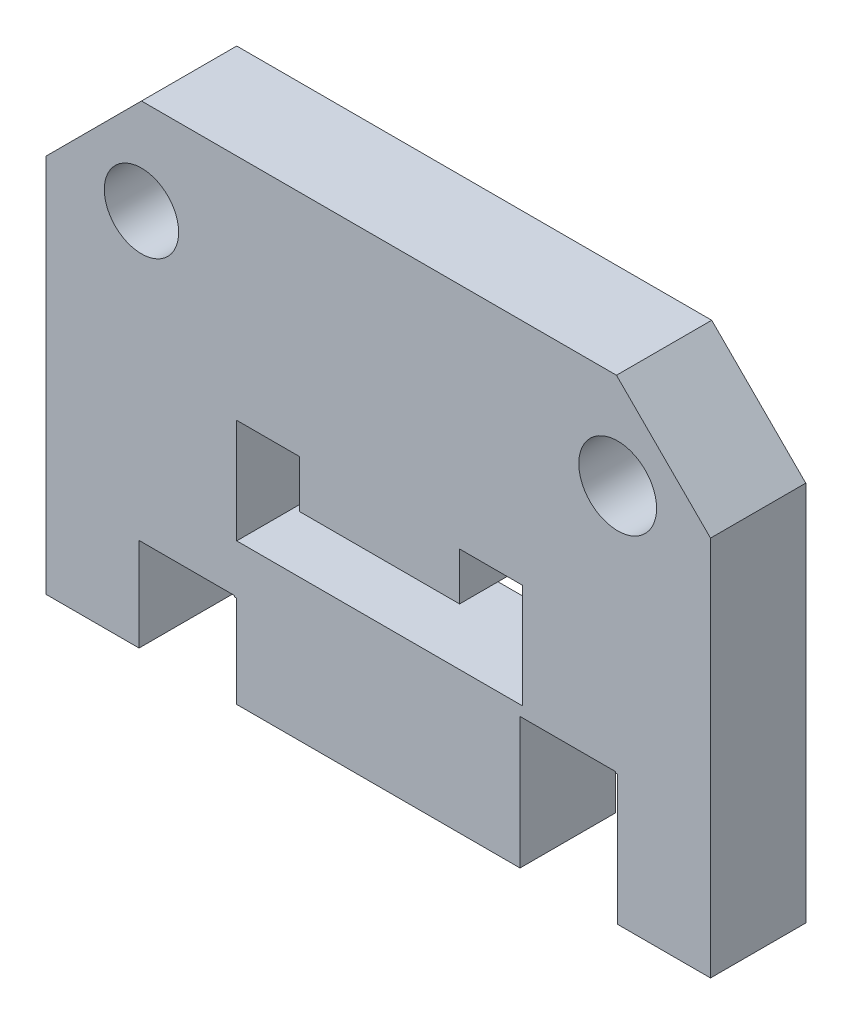
ISO-10303-21;
HEADER;
FILE_DESCRIPTION(('STEP AP214'),'2;1');
FILE_NAME('part.step','',(''),(''),'','','');
FILE_SCHEMA(('AUTOMOTIVE_DESIGN { 1 0 10303 214 1 1 1 1 }'));
ENDSEC;
DATA;
#1=APPLICATION_CONTEXT('core data for automotive mechanical design processes');
#2=APPLICATION_PROTOCOL_DEFINITION('international standard','automotive_design',2000,#1);
#3=PRODUCT_CONTEXT('',#1,'mechanical');
#4=PRODUCT('Part','Part','',(#3));
#5=PRODUCT_RELATED_PRODUCT_CATEGORY('part','',(#4));
#6=PRODUCT_DEFINITION_FORMATION('','',#4);
#7=PRODUCT_DEFINITION_CONTEXT('part definition',#1,'design');
#8=PRODUCT_DEFINITION('design','',#6,#7);
#9=PRODUCT_DEFINITION_SHAPE('','',#8);
#10=(LENGTH_UNIT() NAMED_UNIT(*) SI_UNIT(.MILLI.,.METRE.));
#11=(NAMED_UNIT(*) PLANE_ANGLE_UNIT() SI_UNIT($,.RADIAN.));
#12=(NAMED_UNIT(*) SI_UNIT($,.STERADIAN.) SOLID_ANGLE_UNIT());
#13=UNCERTAINTY_MEASURE_WITH_UNIT(LENGTH_MEASURE(1.E-05),#10,'distance_accuracy_value','');
#14=(GEOMETRIC_REPRESENTATION_CONTEXT(3) GLOBAL_UNCERTAINTY_ASSIGNED_CONTEXT((#13)) GLOBAL_UNIT_ASSIGNED_CONTEXT((#10,
#11,#12)) REPRESENTATION_CONTEXT('',''));
#15=CARTESIAN_POINT('',(0.,0.,0.));
#16=DIRECTION('',(0.,0.,1.));
#17=DIRECTION('',(1.,0.,0.));
#18=AXIS2_PLACEMENT_3D('',#15,#16,#17);
#19=CARTESIAN_POINT('',(0.,-10.,5.));
#20=DIRECTION('',(0.,1.,0.));
#21=DIRECTION('',(0.,0.,1.));
#22=AXIS2_PLACEMENT_3D('',#19,#20,#21);
#23=PLANE('',#22);
#24=DIRECTION('',(1.,0.,0.));
#25=VECTOR('',#24,1.);
#26=CARTESIAN_POINT('',(0.,-10.,-5.));
#27=LINE('',#26,#25);
#28=CARTESIAN_POINT('',(-15.,-10.,-5.));
#29=VERTEX_POINT('',#28);
#30=CARTESIAN_POINT('',(15.,-10.,-5.));
#31=VERTEX_POINT('',#30);
#32=EDGE_CURVE('E298',#29,#31,#27,.T.);
#33=ORIENTED_EDGE('',*,*,#32,.F.);
#34=DIRECTION('',(0.,0.,-1.));
#35=VECTOR('',#34,1.);
#36=CARTESIAN_POINT('',(-15.,-10.,5.));
#37=LINE('',#36,#35);
#38=CARTESIAN_POINT('',(-15.,-10.,5.));
#39=VERTEX_POINT('',#38);
#40=EDGE_CURVE('E11',#39,#29,#37,.T.);
#41=ORIENTED_EDGE('',*,*,#40,.F.);
#42=DIRECTION('',(1.,0.,0.));
#43=VECTOR('',#42,1.);
#44=CARTESIAN_POINT('',(0.,-10.,5.));
#45=LINE('',#44,#43);
#46=CARTESIAN_POINT('',(15.,-10.,5.));
#47=VERTEX_POINT('',#46);
#48=EDGE_CURVE('E430',#39,#47,#45,.T.);
#49=ORIENTED_EDGE('',*,*,#48,.T.);
#50=DIRECTION('',(0.,0.,-1.));
#51=VECTOR('',#50,1.);
#52=CARTESIAN_POINT('',(15.,-10.,5.));
#53=LINE('',#52,#51);
#54=EDGE_CURVE('E58',#47,#31,#53,.T.);
#55=ORIENTED_EDGE('',*,*,#54,.T.);
#56=EDGE_LOOP('',(#33,#41,#49,#55));
#57=FACE_BOUND('',#56,.T.);
#58=ADVANCED_FACE('F39',(#57),#23,.T.);
#59=CARTESIAN_POINT('',(-15.,0.,5.));
#60=DIRECTION('',(-1.,0.,0.));
#61=DIRECTION('',(0.,-1.,0.));
#62=AXIS2_PLACEMENT_3D('',#59,#60,#61);
#63=PLANE('',#62);
#64=DIRECTION('',(0.,1.,0.));
#65=VECTOR('',#64,1.);
#66=CARTESIAN_POINT('',(-15.,0.,-5.));
#67=LINE('',#66,#65);
#68=CARTESIAN_POINT('',(-15.,0.964343272356938,-5.));
#69=VERTEX_POINT('',#68);
#70=EDGE_CURVE('E300',#29,#69,#67,.T.);
#71=ORIENTED_EDGE('',*,*,#70,.T.);
#72=DIRECTION('',(0.,0.,-1.));
#73=VECTOR('',#72,1.);
#74=CARTESIAN_POINT('',(-15.,0.964343272356938,5.));
#75=LINE('',#74,#73);
#76=CARTESIAN_POINT('',(-15.,0.964343272356938,5.));
#77=VERTEX_POINT('',#76);
#78=EDGE_CURVE('E49',#77,#69,#75,.T.);
#79=ORIENTED_EDGE('',*,*,#78,.F.);
#80=DIRECTION('',(0.,1.,0.));
#81=VECTOR('',#80,1.);
#82=CARTESIAN_POINT('',(-15.,0.,5.));
#83=LINE('',#82,#81);
#84=EDGE_CURVE('E432',#39,#77,#83,.T.);
#85=ORIENTED_EDGE('',*,*,#84,.F.);
#86=ORIENTED_EDGE('',*,*,#40,.T.);
#87=EDGE_LOOP('',(#71,#79,#85,#86));
#88=FACE_BOUND('',#87,.T.);
#89=ADVANCED_FACE('F460',(#88),#63,.F.);
#90=CARTESIAN_POINT('',(0.,0.964343272356947,5.));
#91=DIRECTION('',(0.,-1.,0.));
#92=DIRECTION('',(1.,0.,0.));
#93=AXIS2_PLACEMENT_3D('',#90,#91,#92);
#94=PLANE('',#93);
#95=DIRECTION('',(-1.,0.,0.));
#96=VECTOR('',#95,1.);
#97=CARTESIAN_POINT('',(0.,0.964343272356947,-5.));
#98=LINE('',#97,#96);
#99=CARTESIAN_POINT('',(-8.39856566274377,0.964343272356942,-5.));
#100=VERTEX_POINT('',#99);
#101=EDGE_CURVE('E303',#100,#69,#98,.T.);
#102=ORIENTED_EDGE('',*,*,#101,.F.);
#103=DIRECTION('',(0.,0.,-1.));
#104=VECTOR('',#103,1.);
#105=CARTESIAN_POINT('',(-8.39856566274377,0.964343272356942,5.));
#106=LINE('',#105,#104);
#107=CARTESIAN_POINT('',(-8.39856566274377,0.964343272356942,5.));
#108=VERTEX_POINT('',#107);
#109=EDGE_CURVE('E324',#108,#100,#106,.T.);
#110=ORIENTED_EDGE('',*,*,#109,.F.);
#111=DIRECTION('',(-1.,0.,0.));
#112=VECTOR('',#111,1.);
#113=CARTESIAN_POINT('',(0.,0.964343272356947,5.));
#114=LINE('',#113,#112);
#115=EDGE_CURVE('E434',#108,#77,#114,.T.);
#116=ORIENTED_EDGE('',*,*,#115,.T.);
#117=ORIENTED_EDGE('',*,*,#78,.T.);
#118=EDGE_LOOP('',(#102,#110,#116,#117));
#119=FACE_BOUND('',#118,.T.);
#120=ADVANCED_FACE('F465',(#119),#94,.T.);
#121=CARTESIAN_POINT('',(-8.39856566274378,0.,5.));
#122=DIRECTION('',(1.,0.,0.));
#123=DIRECTION('',(0.,1.,0.));
#124=AXIS2_PLACEMENT_3D('',#121,#122,#123);
#125=PLANE('',#124);
#126=DIRECTION('',(0.,-1.,0.));
#127=VECTOR('',#126,1.);
#128=CARTESIAN_POINT('',(-8.39856566274378,0.,-5.));
#129=LINE('',#128,#127);
#130=CARTESIAN_POINT('',(-8.3985656627438,-4.03565672764305,-5.));
#131=VERTEX_POINT('',#130);
#132=EDGE_CURVE('E306',#100,#131,#129,.T.);
#133=ORIENTED_EDGE('',*,*,#132,.T.);
#134=DIRECTION('',(0.,0.,-1.));
#135=VECTOR('',#134,1.);
#136=CARTESIAN_POINT('',(-8.3985656627438,-4.03565672764305,5.));
#137=LINE('',#136,#135);
#138=CARTESIAN_POINT('',(-8.3985656627438,-4.03565672764305,5.));
#139=VERTEX_POINT('',#138);
#140=EDGE_CURVE('E322',#139,#131,#137,.T.);
#141=ORIENTED_EDGE('',*,*,#140,.F.);
#142=DIRECTION('',(0.,-1.,0.));
#143=VECTOR('',#142,1.);
#144=CARTESIAN_POINT('',(-8.39856566274378,0.,5.));
#145=LINE('',#144,#143);
#146=EDGE_CURVE('E244',#108,#139,#145,.T.);
#147=ORIENTED_EDGE('',*,*,#146,.F.);
#148=ORIENTED_EDGE('',*,*,#109,.T.);
#149=EDGE_LOOP('',(#133,#141,#147,#148));
#150=FACE_BOUND('',#149,.T.);
#151=ADVANCED_FACE('F440',(#150),#125,.F.);
#152=CARTESIAN_POINT('',(0.,-4.03565672764305,5.));
#153=DIRECTION('',(0.,-1.,0.));
#154=DIRECTION('',(0.,0.,-1.));
#155=AXIS2_PLACEMENT_3D('',#152,#153,#154);
#156=PLANE('',#155);
#157=DIRECTION('',(-1.,0.,0.));
#158=VECTOR('',#157,1.);
#159=CARTESIAN_POINT('',(0.,-4.03565672764305,-5.));
#160=LINE('',#159,#158);
#161=CARTESIAN_POINT('',(8.39856566274377,-4.03565672764305,-5.));
#162=VERTEX_POINT('',#161);
#163=EDGE_CURVE('E309',#162,#131,#160,.T.);
#164=ORIENTED_EDGE('',*,*,#163,.F.);
#165=DIRECTION('',(0.,0.,-1.));
#166=VECTOR('',#165,1.);
#167=CARTESIAN_POINT('',(8.39856566274377,-4.03565672764305,5.));
#168=LINE('',#167,#166);
#169=CARTESIAN_POINT('',(8.39856566274377,-4.03565672764305,5.));
#170=VERTEX_POINT('',#169);
#171=EDGE_CURVE('E230',#170,#162,#168,.T.);
#172=ORIENTED_EDGE('',*,*,#171,.F.);
#173=DIRECTION('',(-1.,0.,0.));
#174=VECTOR('',#173,1.);
#175=CARTESIAN_POINT('',(0.,-4.03565672764305,5.));
#176=LINE('',#175,#174);
#177=EDGE_CURVE('E242',#170,#139,#176,.T.);
#178=ORIENTED_EDGE('',*,*,#177,.T.);
#179=ORIENTED_EDGE('',*,*,#140,.T.);
#180=EDGE_LOOP('',(#164,#172,#178,#179));
#181=FACE_BOUND('',#180,.T.);
#182=ADVANCED_FACE('F444',(#181),#156,.T.);
#183=CARTESIAN_POINT('',(8.39856566274377,0.,5.));
#184=DIRECTION('',(1.,0.,0.));
#185=DIRECTION('',(0.,0.,-1.));
#186=AXIS2_PLACEMENT_3D('',#183,#184,#185);
#187=PLANE('',#186);
#188=DIRECTION('',(0.,-1.,0.));
#189=VECTOR('',#188,1.);
#190=CARTESIAN_POINT('',(8.39856566274377,0.,-5.));
#191=LINE('',#190,#189);
#192=CARTESIAN_POINT('',(8.39856566274377,0.964343272356947,-5.));
#193=VERTEX_POINT('',#192);
#194=EDGE_CURVE('E227',#193,#162,#191,.T.);
#195=ORIENTED_EDGE('',*,*,#194,.F.);
#196=DIRECTION('',(0.,0.,-1.));
#197=VECTOR('',#196,1.);
#198=CARTESIAN_POINT('',(8.39856566274377,0.964343272356947,5.));
#199=LINE('',#198,#197);
#200=CARTESIAN_POINT('',(8.39856566274377,0.964343272356947,5.));
#201=VERTEX_POINT('',#200);
#202=EDGE_CURVE('E221',#201,#193,#199,.T.);
#203=ORIENTED_EDGE('',*,*,#202,.F.);
#204=DIRECTION('',(0.,-1.,0.));
#205=VECTOR('',#204,1.);
#206=CARTESIAN_POINT('',(8.39856566274377,0.,5.));
#207=LINE('',#206,#205);
#208=EDGE_CURVE('E225',#201,#170,#207,.T.);
#209=ORIENTED_EDGE('',*,*,#208,.T.);
#210=ORIENTED_EDGE('',*,*,#171,.T.);
#211=EDGE_LOOP('',(#195,#203,#209,#210));
#212=FACE_BOUND('',#211,.T.);
#213=ADVANCED_FACE('F223',(#212),#187,.T.);
#214=CARTESIAN_POINT('',(0.,0.964343272356947,5.));
#215=DIRECTION('',(0.,1.,0.));
#216=DIRECTION('',(0.,0.,1.));
#217=AXIS2_PLACEMENT_3D('',#214,#215,#216);
#218=PLANE('',#217);
#219=DIRECTION('',(1.,0.,0.));
#220=VECTOR('',#219,1.);
#221=CARTESIAN_POINT('',(0.,0.964343272356947,-5.));
#222=LINE('',#221,#220);
#223=CARTESIAN_POINT('',(15.,0.964343272356947,-5.));
#224=VERTEX_POINT('',#223);
#225=EDGE_CURVE('E313',#193,#224,#222,.T.);
#226=ORIENTED_EDGE('',*,*,#225,.T.);
#227=DIRECTION('',(0.,0.,-1.));
#228=VECTOR('',#227,1.);
#229=CARTESIAN_POINT('',(15.,0.964343272356947,5.));
#230=LINE('',#229,#228);
#231=CARTESIAN_POINT('',(15.,0.964343272356947,5.));
#232=VERTEX_POINT('',#231);
#233=EDGE_CURVE('E138',#232,#224,#230,.T.);
#234=ORIENTED_EDGE('',*,*,#233,.F.);
#235=DIRECTION('',(1.,0.,0.));
#236=VECTOR('',#235,1.);
#237=CARTESIAN_POINT('',(0.,0.964343272356947,5.));
#238=LINE('',#237,#236);
#239=EDGE_CURVE('E232',#201,#232,#238,.T.);
#240=ORIENTED_EDGE('',*,*,#239,.F.);
#241=ORIENTED_EDGE('',*,*,#202,.T.);
#242=EDGE_LOOP('',(#226,#234,#240,#241));
#243=FACE_BOUND('',#242,.T.);
#244=ADVANCED_FACE('F233',(#243),#218,.F.);
#245=CARTESIAN_POINT('',(25.,0.,5.));
#246=DIRECTION('',(1.,0.,0.));
#247=DIRECTION('',(0.,0.,-1.));
#248=AXIS2_PLACEMENT_3D('',#245,#246,#247);
#249=PLANE('',#248);
#250=DIRECTION('',(0.,-1.,0.));
#251=VECTOR('',#250,1.);
#252=CARTESIAN_POINT('',(25.,0.,-5.));
#253=LINE('',#252,#251);
#254=CARTESIAN_POINT('',(25.,-11.2155581873279,-5.));
#255=VERTEX_POINT('',#254);
#256=CARTESIAN_POINT('',(25.,-24.8736640663895,-5.));
#257=VERTEX_POINT('',#256);
#258=EDGE_CURVE('E256',#255,#257,#253,.T.);
#259=ORIENTED_EDGE('',*,*,#258,.T.);
#260=DIRECTION('',(0.,0.,-1.));
#261=VECTOR('',#260,1.);
#262=CARTESIAN_POINT('',(25.,-24.8736640663895,5.));
#263=LINE('',#262,#261);
#264=CARTESIAN_POINT('',(25.,-24.8736640663895,5.));
#265=VERTEX_POINT('',#264);
#266=EDGE_CURVE('E43',#265,#257,#263,.T.);
#267=ORIENTED_EDGE('',*,*,#266,.F.);
#268=DIRECTION('',(0.,-1.,0.));
#269=VECTOR('',#268,1.);
#270=CARTESIAN_POINT('',(25.,0.,5.));
#271=LINE('',#270,#269);
#272=CARTESIAN_POINT('',(25.,-11.2155581873279,5.));
#273=VERTEX_POINT('',#272);
#274=EDGE_CURVE('E674',#273,#265,#271,.T.);
#275=ORIENTED_EDGE('',*,*,#274,.F.);
#276=DIRECTION('',(0.,0.,-1.));
#277=VECTOR('',#276,1.);
#278=CARTESIAN_POINT('',(25.,-11.2155581873279,5.));
#279=LINE('',#278,#277);
#280=EDGE_CURVE('E249',#273,#255,#279,.T.);
#281=ORIENTED_EDGE('',*,*,#280,.T.);
#282=EDGE_LOOP('',(#259,#267,#275,#281));
#283=FACE_BOUND('',#282,.T.);
#284=ADVANCED_FACE('F378',(#283),#249,.F.);
#285=CARTESIAN_POINT('',(0.,-24.8736640663895,5.));
#286=DIRECTION('',(0.,1.,0.));
#287=DIRECTION('',(0.,0.,1.));
#288=AXIS2_PLACEMENT_3D('',#285,#286,#287);
#289=PLANE('',#288);
#290=DIRECTION('',(1.,0.,0.));
#291=VECTOR('',#290,1.);
#292=CARTESIAN_POINT('',(0.,-24.8736640663895,-5.));
#293=LINE('',#292,#291);
#294=CARTESIAN_POINT('',(34.7473281327791,-24.8736640663895,-5.));
#295=VERTEX_POINT('',#294);
#296=EDGE_CURVE('E259',#257,#295,#293,.T.);
#297=ORIENTED_EDGE('',*,*,#296,.T.);
#298=DIRECTION('',(0.,0.,-1.));
#299=VECTOR('',#298,1.);
#300=CARTESIAN_POINT('',(34.7473281327791,-24.8736640663895,5.));
#301=LINE('',#300,#299);
#302=CARTESIAN_POINT('',(34.7473281327791,-24.8736640663895,5.));
#303=VERTEX_POINT('',#302);
#304=EDGE_CURVE('E369',#303,#295,#301,.T.);
#305=ORIENTED_EDGE('',*,*,#304,.F.);
#306=DIRECTION('',(1.,0.,0.));
#307=VECTOR('',#306,1.);
#308=CARTESIAN_POINT('',(0.,-24.8736640663895,5.));
#309=LINE('',#308,#307);
#310=EDGE_CURVE('E151',#265,#303,#309,.T.);
#311=ORIENTED_EDGE('',*,*,#310,.F.);
#312=ORIENTED_EDGE('',*,*,#266,.T.);
#313=EDGE_LOOP('',(#297,#305,#311,#312));
#314=FACE_BOUND('',#313,.T.);
#315=ADVANCED_FACE('F374',(#314),#289,.F.);
#316=CARTESIAN_POINT('',(34.7473281327791,0.,5.));
#317=DIRECTION('',(1.,0.,0.));
#318=DIRECTION('',(0.,0.,-1.));
#319=AXIS2_PLACEMENT_3D('',#316,#317,#318);
#320=PLANE('',#319);
#321=DIRECTION('',(0.,-1.,0.));
#322=VECTOR('',#321,1.);
#323=CARTESIAN_POINT('',(34.7473281327791,0.,-5.));
#324=LINE('',#323,#322);
#325=CARTESIAN_POINT('',(34.7473281327791,15.1263359336105,-5.));
#326=VERTEX_POINT('',#325);
#327=EDGE_CURVE('E262',#326,#295,#324,.T.);
#328=ORIENTED_EDGE('',*,*,#327,.F.);
#329=DIRECTION('',(0.,0.,-1.));
#330=VECTOR('',#329,1.);
#331=CARTESIAN_POINT('',(34.7473281327791,15.1263359336105,5.));
#332=LINE('',#331,#330);
#333=CARTESIAN_POINT('',(34.7473281327791,15.1263359336105,5.));
#334=VERTEX_POINT('',#333);
#335=EDGE_CURVE('E368',#334,#326,#332,.T.);
#336=ORIENTED_EDGE('',*,*,#335,.F.);
#337=DIRECTION('',(0.,-1.,0.));
#338=VECTOR('',#337,1.);
#339=CARTESIAN_POINT('',(34.7473281327791,0.,5.));
#340=LINE('',#339,#338);
#341=EDGE_CURVE('E388',#334,#303,#340,.T.);
#342=ORIENTED_EDGE('',*,*,#341,.T.);
#343=ORIENTED_EDGE('',*,*,#304,.T.);
#344=EDGE_LOOP('',(#328,#336,#342,#343));
#345=FACE_BOUND('',#344,.T.);
#346=ADVANCED_FACE('F386',(#345),#320,.T.);
#347=CARTESIAN_POINT('',(24.9368320331948,24.9368320331948,5.));
#348=DIRECTION('',(0.707106781186548,0.707106781186548,0.));
#349=DIRECTION('',(-0.707106781186548,0.707106781186548,0.));
#350=AXIS2_PLACEMENT_3D('',#347,#348,#349);
#351=PLANE('',#350);
#352=DIRECTION('',(0.707106781186548,-0.707106781186548,0.));
#353=VECTOR('',#352,1.);
#354=CARTESIAN_POINT('',(24.9368320331948,24.9368320331948,-5.));
#355=LINE('',#354,#353);
#356=CARTESIAN_POINT('',(24.8736640663895,25.,-5.));
#357=VERTEX_POINT('',#356);
#358=EDGE_CURVE('E265',#357,#326,#355,.T.);
#359=ORIENTED_EDGE('',*,*,#358,.F.);
#360=DIRECTION('',(0.,0.,-1.));
#361=VECTOR('',#360,1.);
#362=CARTESIAN_POINT('',(24.8736640663895,25.,5.));
#363=LINE('',#362,#361);
#364=CARTESIAN_POINT('',(24.8736640663895,25.,5.));
#365=VERTEX_POINT('',#364);
#366=EDGE_CURVE('E366',#365,#357,#363,.T.);
#367=ORIENTED_EDGE('',*,*,#366,.F.);
#368=DIRECTION('',(0.707106781186548,-0.707106781186548,0.));
#369=VECTOR('',#368,1.);
#370=CARTESIAN_POINT('',(24.9368320331948,24.9368320331948,5.));
#371=LINE('',#370,#369);
#372=EDGE_CURVE('E394',#365,#334,#371,.T.);
#373=ORIENTED_EDGE('',*,*,#372,.T.);
#374=ORIENTED_EDGE('',*,*,#335,.T.);
#375=EDGE_LOOP('',(#359,#367,#373,#374));
#376=FACE_BOUND('',#375,.T.);
#377=ADVANCED_FACE('F397',(#376),#351,.T.);
#378=CARTESIAN_POINT('',(0.,25.,5.));
#379=DIRECTION('',(0.,1.,0.));
#380=DIRECTION('',(0.,0.,1.));
#381=AXIS2_PLACEMENT_3D('',#378,#379,#380);
#382=PLANE('',#381);
#383=DIRECTION('',(1.,0.,0.));
#384=VECTOR('',#383,1.);
#385=CARTESIAN_POINT('',(0.,25.,-5.));
#386=LINE('',#385,#384);
#387=CARTESIAN_POINT('',(-25.,25.,-5.));
#388=VERTEX_POINT('',#387);
#389=EDGE_CURVE('E268',#388,#357,#386,.T.);
#390=ORIENTED_EDGE('',*,*,#389,.F.);
#391=DIRECTION('',(0.,0.,-1.));
#392=VECTOR('',#391,1.);
#393=CARTESIAN_POINT('',(-25.,25.,5.));
#394=LINE('',#393,#392);
#395=CARTESIAN_POINT('',(-25.,25.,5.));
#396=VERTEX_POINT('',#395);
#397=EDGE_CURVE('E364',#396,#388,#394,.T.);
#398=ORIENTED_EDGE('',*,*,#397,.F.);
#399=DIRECTION('',(1.,0.,0.));
#400=VECTOR('',#399,1.);
#401=CARTESIAN_POINT('',(0.,25.,5.));
#402=LINE('',#401,#400);
#403=EDGE_CURVE('E398',#396,#365,#402,.T.);
#404=ORIENTED_EDGE('',*,*,#403,.T.);
#405=ORIENTED_EDGE('',*,*,#366,.T.);
#406=EDGE_LOOP('',(#390,#398,#404,#405));
#407=FACE_BOUND('',#406,.T.);
#408=ADVANCED_FACE('F521',(#407),#382,.T.);
#409=CARTESIAN_POINT('',(-25.,25.,5.));
#410=DIRECTION('',(-0.707106781186548,0.707106781186548,0.));
#411=DIRECTION('',(-0.707106781186548,-0.707106781186548,0.));
#412=AXIS2_PLACEMENT_3D('',#409,#410,#411);
#413=PLANE('',#412);
#414=DIRECTION('',(0.707106781186548,0.707106781186548,0.));
#415=VECTOR('',#414,1.);
#416=CARTESIAN_POINT('',(-25.,25.,-5.));
#417=LINE('',#416,#415);
#418=CARTESIAN_POINT('',(-35.,15.,-5.));
#419=VERTEX_POINT('',#418);
#420=EDGE_CURVE('E271',#419,#388,#417,.T.);
#421=ORIENTED_EDGE('',*,*,#420,.F.);
#422=DIRECTION('',(0.,0.,-1.));
#423=VECTOR('',#422,1.);
#424=CARTESIAN_POINT('',(-35.,15.,5.));
#425=LINE('',#424,#423);
#426=CARTESIAN_POINT('',(-35.,15.,5.));
#427=VERTEX_POINT('',#426);
#428=EDGE_CURVE('E362',#427,#419,#425,.T.);
#429=ORIENTED_EDGE('',*,*,#428,.F.);
#430=DIRECTION('',(0.707106781186548,0.707106781186548,0.));
#431=VECTOR('',#430,1.);
#432=CARTESIAN_POINT('',(-25.,25.,5.));
#433=LINE('',#432,#431);
#434=EDGE_CURVE('E400',#427,#396,#433,.T.);
#435=ORIENTED_EDGE('',*,*,#434,.T.);
#436=ORIENTED_EDGE('',*,*,#397,.T.);
#437=EDGE_LOOP('',(#421,#429,#435,#436));
#438=FACE_BOUND('',#437,.T.);
#439=ADVANCED_FACE('F517',(#438),#413,.T.);
#440=CARTESIAN_POINT('',(-35.,0.,5.));
#441=DIRECTION('',(1.,0.,0.));
#442=DIRECTION('',(0.,0.,-1.));
#443=AXIS2_PLACEMENT_3D('',#440,#441,#442);
#444=PLANE('',#443);
#445=DIRECTION('',(0.,-1.,0.));
#446=VECTOR('',#445,1.);
#447=CARTESIAN_POINT('',(-35.,0.,-5.));
#448=LINE('',#447,#446);
#449=CARTESIAN_POINT('',(-35.,-24.8736640663895,-5.));
#450=VERTEX_POINT('',#449);
#451=EDGE_CURVE('E274',#419,#450,#448,.T.);
#452=ORIENTED_EDGE('',*,*,#451,.T.);
#453=DIRECTION('',(0.,0.,-1.));
#454=VECTOR('',#453,1.);
#455=CARTESIAN_POINT('',(-35.,-24.8736640663895,5.));
#456=LINE('',#455,#454);
#457=CARTESIAN_POINT('',(-35.,-24.8736640663895,5.));
#458=VERTEX_POINT('',#457);
#459=EDGE_CURVE('E359',#458,#450,#456,.T.);
#460=ORIENTED_EDGE('',*,*,#459,.F.);
#461=DIRECTION('',(0.,-1.,0.));
#462=VECTOR('',#461,1.);
#463=CARTESIAN_POINT('',(-35.,0.,5.));
#464=LINE('',#463,#462);
#465=EDGE_CURVE('E406',#427,#458,#464,.T.);
#466=ORIENTED_EDGE('',*,*,#465,.F.);
#467=ORIENTED_EDGE('',*,*,#428,.T.);
#468=EDGE_LOOP('',(#452,#460,#466,#467));
#469=FACE_BOUND('',#468,.T.);
#470=ADVANCED_FACE('F513',(#469),#444,.F.);
#471=CARTESIAN_POINT('',(0.,-24.8736640663895,5.));
#472=DIRECTION('',(0.,1.,0.));
#473=DIRECTION('',(0.,0.,1.));
#474=AXIS2_PLACEMENT_3D('',#471,#472,#473);
#475=PLANE('',#474);
#476=DIRECTION('',(1.,0.,0.));
#477=VECTOR('',#476,1.);
#478=CARTESIAN_POINT('',(0.,-24.8736640663895,-5.));
#479=LINE('',#478,#477);
#480=CARTESIAN_POINT('',(-25.2526718672209,-24.8736640663895,-5.));
#481=VERTEX_POINT('',#480);
#482=EDGE_CURVE('E276',#450,#481,#479,.T.);
#483=ORIENTED_EDGE('',*,*,#482,.T.);
#484=DIRECTION('',(0.,0.,-1.));
#485=VECTOR('',#484,1.);
#486=CARTESIAN_POINT('',(-25.2526718672209,-24.8736640663895,5.));
#487=LINE('',#486,#485);
#488=CARTESIAN_POINT('',(-25.2526718672209,-24.8736640663895,5.));
#489=VERTEX_POINT('',#488);
#490=EDGE_CURVE('E356',#489,#481,#487,.T.);
#491=ORIENTED_EDGE('',*,*,#490,.F.);
#492=DIRECTION('',(1.,0.,0.));
#493=VECTOR('',#492,1.);
#494=CARTESIAN_POINT('',(0.,-24.8736640663895,5.));
#495=LINE('',#494,#493);
#496=EDGE_CURVE('E408',#458,#489,#495,.T.);
#497=ORIENTED_EDGE('',*,*,#496,.F.);
#498=ORIENTED_EDGE('',*,*,#459,.T.);
#499=EDGE_LOOP('',(#483,#491,#497,#498));
#500=FACE_BOUND('',#499,.T.);
#501=ADVANCED_FACE('F509',(#500),#475,.F.);
#502=CARTESIAN_POINT('',(-25.2526718672209,0.,5.));
#503=DIRECTION('',(-1.,0.,0.));
#504=DIRECTION('',(0.,0.,1.));
#505=AXIS2_PLACEMENT_3D('',#502,#503,#504);
#506=PLANE('',#505);
#507=DIRECTION('',(0.,1.,0.));
#508=VECTOR('',#507,1.);
#509=CARTESIAN_POINT('',(-25.2526718672209,0.,-5.));
#510=LINE('',#509,#508);
#511=CARTESIAN_POINT('',(-25.2526718672209,-15.0835652404795,-5.));
#512=VERTEX_POINT('',#511);
#513=EDGE_CURVE('E278',#481,#512,#510,.T.);
#514=ORIENTED_EDGE('',*,*,#513,.T.);
#515=DIRECTION('',(0.,0.,-1.));
#516=VECTOR('',#515,1.);
#517=CARTESIAN_POINT('',(-25.2526718672209,-15.0835652404795,5.));
#518=LINE('',#517,#516);
#519=CARTESIAN_POINT('',(-25.2526718672209,-15.0835652404795,5.));
#520=VERTEX_POINT('',#519);
#521=EDGE_CURVE('E353',#520,#512,#518,.T.);
#522=ORIENTED_EDGE('',*,*,#521,.F.);
#523=DIRECTION('',(0.,1.,0.));
#524=VECTOR('',#523,1.);
#525=CARTESIAN_POINT('',(-25.2526718672209,0.,5.));
#526=LINE('',#525,#524);
#527=EDGE_CURVE('E410',#489,#520,#526,.T.);
#528=ORIENTED_EDGE('',*,*,#527,.F.);
#529=ORIENTED_EDGE('',*,*,#490,.T.);
#530=EDGE_LOOP('',(#514,#522,#528,#529));
#531=FACE_BOUND('',#530,.T.);
#532=ADVANCED_FACE('F505',(#531),#506,.F.);
#533=CARTESIAN_POINT('',(0.,-15.0835652404795,5.));
#534=DIRECTION('',(0.,1.,0.));
#535=DIRECTION('',(0.,0.,1.));
#536=AXIS2_PLACEMENT_3D('',#533,#534,#535);
#537=PLANE('',#536);
#538=DIRECTION('',(1.,0.,0.));
#539=VECTOR('',#538,1.);
#540=CARTESIAN_POINT('',(0.,-15.0835652404795,-5.));
#541=LINE('',#540,#539);
#542=CARTESIAN_POINT('',(-15.2526718672209,-15.0835652404795,-5.));
#543=VERTEX_POINT('',#542);
#544=EDGE_CURVE('E280',#512,#543,#541,.T.);
#545=ORIENTED_EDGE('',*,*,#544,.T.);
#546=DIRECTION('',(0.,0.,-1.));
#547=VECTOR('',#546,1.);
#548=CARTESIAN_POINT('',(-15.2526718672209,-15.0835652404795,5.));
#549=LINE('',#548,#547);
#550=CARTESIAN_POINT('',(-15.2526718672209,-15.0835652404795,5.));
#551=VERTEX_POINT('',#550);
#552=EDGE_CURVE('E350',#551,#543,#549,.T.);
#553=ORIENTED_EDGE('',*,*,#552,.F.);
#554=DIRECTION('',(1.,0.,0.));
#555=VECTOR('',#554,1.);
#556=CARTESIAN_POINT('',(0.,-15.0835652404795,5.));
#557=LINE('',#556,#555);
#558=EDGE_CURVE('E412',#520,#551,#557,.T.);
#559=ORIENTED_EDGE('',*,*,#558,.F.);
#560=ORIENTED_EDGE('',*,*,#521,.T.);
#561=EDGE_LOOP('',(#545,#553,#559,#560));
#562=FACE_BOUND('',#561,.T.);
#563=ADVANCED_FACE('F501',(#562),#537,.F.);
#564=CARTESIAN_POINT('',(-15.2526718672209,0.,5.));
#565=DIRECTION('',(1.,0.,0.));
#566=DIRECTION('',(0.,1.,0.));
#567=AXIS2_PLACEMENT_3D('',#564,#565,#566);
#568=PLANE('',#567);
#569=DIRECTION('',(0.,-1.,0.));
#570=VECTOR('',#569,1.);
#571=CARTESIAN_POINT('',(-15.2526718672209,0.,-5.));
#572=LINE('',#571,#570);
#573=CARTESIAN_POINT('',(-15.2526718672209,-15.2099011740899,-5.));
#574=VERTEX_POINT('',#573);
#575=EDGE_CURVE('E282',#543,#574,#572,.T.);
#576=ORIENTED_EDGE('',*,*,#575,.T.);
#577=DIRECTION('',(0.,0.,-1.));
#578=VECTOR('',#577,1.);
#579=CARTESIAN_POINT('',(-15.2526718672209,-15.2099011740899,5.));
#580=LINE('',#579,#578);
#581=CARTESIAN_POINT('',(-15.2526718672209,-15.2099011740899,5.));
#582=VERTEX_POINT('',#581);
#583=EDGE_CURVE('E347',#582,#574,#580,.T.);
#584=ORIENTED_EDGE('',*,*,#583,.F.);
#585=DIRECTION('',(0.,-1.,0.));
#586=VECTOR('',#585,1.);
#587=CARTESIAN_POINT('',(-15.2526718672209,0.,5.));
#588=LINE('',#587,#586);
#589=EDGE_CURVE('E414',#551,#582,#588,.T.);
#590=ORIENTED_EDGE('',*,*,#589,.F.);
#591=ORIENTED_EDGE('',*,*,#552,.T.);
#592=EDGE_LOOP('',(#576,#584,#590,#591));
#593=FACE_BOUND('',#592,.T.);
#594=ADVANCED_FACE('F497',(#593),#568,.F.);
#595=CARTESIAN_POINT('',(0.,-15.2099011740899,5.));
#596=DIRECTION('',(0.,1.,0.));
#597=DIRECTION('',(0.,0.,1.));
#598=AXIS2_PLACEMENT_3D('',#595,#596,#597);
#599=PLANE('',#598);
#600=DIRECTION('',(1.,0.,0.));
#601=VECTOR('',#600,1.);
#602=CARTESIAN_POINT('',(0.,-15.2099011740899,-5.));
#603=LINE('',#602,#601);
#604=CARTESIAN_POINT('',(-15.,-15.2099011740899,-5.));
#605=VERTEX_POINT('',#604);
#606=EDGE_CURVE('E284',#574,#605,#603,.T.);
#607=ORIENTED_EDGE('',*,*,#606,.T.);
#608=DIRECTION('',(0.,0.,-1.));
#609=VECTOR('',#608,1.);
#610=CARTESIAN_POINT('',(-15.,-15.2099011740899,5.));
#611=LINE('',#610,#609);
#612=CARTESIAN_POINT('',(-15.,-15.2099011740899,5.));
#613=VERTEX_POINT('',#612);
#614=EDGE_CURVE('E344',#613,#605,#611,.T.);
#615=ORIENTED_EDGE('',*,*,#614,.F.);
#616=DIRECTION('',(1.,0.,0.));
#617=VECTOR('',#616,1.);
#618=CARTESIAN_POINT('',(0.,-15.2099011740899,5.));
#619=LINE('',#618,#617);
#620=EDGE_CURVE('E416',#582,#613,#619,.T.);
#621=ORIENTED_EDGE('',*,*,#620,.F.);
#622=ORIENTED_EDGE('',*,*,#583,.T.);
#623=EDGE_LOOP('',(#607,#615,#621,#622));
#624=FACE_BOUND('',#623,.T.);
#625=ADVANCED_FACE('F493',(#624),#599,.F.);
#626=CARTESIAN_POINT('',(-15.,0.,5.));
#627=DIRECTION('',(1.,0.,0.));
#628=DIRECTION('',(0.,1.,0.));
#629=AXIS2_PLACEMENT_3D('',#626,#627,#628);
#630=PLANE('',#629);
#631=DIRECTION('',(0.,-1.,0.));
#632=VECTOR('',#631,1.);
#633=CARTESIAN_POINT('',(-15.,0.,-5.));
#634=LINE('',#633,#632);
#635=CARTESIAN_POINT('',(-15.,-24.8736640663895,-5.));
#636=VERTEX_POINT('',#635);
#637=EDGE_CURVE('E286',#605,#636,#634,.T.);
#638=ORIENTED_EDGE('',*,*,#637,.T.);
#639=DIRECTION('',(0.,0.,-1.));
#640=VECTOR('',#639,1.);
#641=CARTESIAN_POINT('',(-15.,-24.8736640663895,5.));
#642=LINE('',#641,#640);
#643=CARTESIAN_POINT('',(-15.,-24.8736640663895,5.));
#644=VERTEX_POINT('',#643);
#645=EDGE_CURVE('E341',#644,#636,#642,.T.);
#646=ORIENTED_EDGE('',*,*,#645,.F.);
#647=DIRECTION('',(0.,-1.,0.));
#648=VECTOR('',#647,1.);
#649=CARTESIAN_POINT('',(-15.,0.,5.));
#650=LINE('',#649,#648);
#651=EDGE_CURVE('E418',#613,#644,#650,.T.);
#652=ORIENTED_EDGE('',*,*,#651,.F.);
#653=ORIENTED_EDGE('',*,*,#614,.T.);
#654=EDGE_LOOP('',(#638,#646,#652,#653));
#655=FACE_BOUND('',#654,.T.);
#656=ADVANCED_FACE('F489',(#655),#630,.F.);
#657=CARTESIAN_POINT('',(0.,-24.8736640663895,5.));
#658=DIRECTION('',(0.,1.,0.));
#659=DIRECTION('',(0.,0.,1.));
#660=AXIS2_PLACEMENT_3D('',#657,#658,#659);
#661=PLANE('',#660);
#662=DIRECTION('',(1.,0.,0.));
#663=VECTOR('',#662,1.);
#664=CARTESIAN_POINT('',(0.,-24.8736640663895,-5.));
#665=LINE('',#664,#663);
#666=CARTESIAN_POINT('',(14.7473281327791,-24.8736640663895,-5.));
#667=VERTEX_POINT('',#666);
#668=EDGE_CURVE('E288',#636,#667,#665,.T.);
#669=ORIENTED_EDGE('',*,*,#668,.T.);
#670=DIRECTION('',(0.,0.,-1.));
#671=VECTOR('',#670,1.);
#672=CARTESIAN_POINT('',(14.7473281327791,-24.8736640663895,5.));
#673=LINE('',#672,#671);
#674=CARTESIAN_POINT('',(14.7473281327791,-24.8736640663895,5.));
#675=VERTEX_POINT('',#674);
#676=EDGE_CURVE('E338',#675,#667,#673,.T.);
#677=ORIENTED_EDGE('',*,*,#676,.F.);
#678=DIRECTION('',(1.,0.,0.));
#679=VECTOR('',#678,1.);
#680=CARTESIAN_POINT('',(0.,-24.8736640663895,5.));
#681=LINE('',#680,#679);
#682=EDGE_CURVE('E420',#644,#675,#681,.T.);
#683=ORIENTED_EDGE('',*,*,#682,.F.);
#684=ORIENTED_EDGE('',*,*,#645,.T.);
#685=EDGE_LOOP('',(#669,#677,#683,#684));
#686=FACE_BOUND('',#685,.T.);
#687=ADVANCED_FACE('F485',(#686),#661,.F.);
#688=CARTESIAN_POINT('',(14.7473281327791,0.,5.));
#689=DIRECTION('',(-1.,0.,0.));
#690=DIRECTION('',(0.,0.,1.));
#691=AXIS2_PLACEMENT_3D('',#688,#689,#690);
#692=PLANE('',#691);
#693=DIRECTION('',(0.,1.,0.));
#694=VECTOR('',#693,1.);
#695=CARTESIAN_POINT('',(14.7473281327791,0.,-5.));
#696=LINE('',#695,#694);
#697=CARTESIAN_POINT('',(14.7473281327791,-11.0892222537174,-5.));
#698=VERTEX_POINT('',#697);
#699=EDGE_CURVE('E290',#667,#698,#696,.T.);
#700=ORIENTED_EDGE('',*,*,#699,.T.);
#701=DIRECTION('',(0.,0.,-1.));
#702=VECTOR('',#701,1.);
#703=CARTESIAN_POINT('',(14.7473281327791,-11.0892222537174,5.));
#704=LINE('',#703,#702);
#705=CARTESIAN_POINT('',(14.7473281327791,-11.0892222537174,5.));
#706=VERTEX_POINT('',#705);
#707=EDGE_CURVE('E335',#706,#698,#704,.T.);
#708=ORIENTED_EDGE('',*,*,#707,.F.);
#709=DIRECTION('',(0.,1.,0.));
#710=VECTOR('',#709,1.);
#711=CARTESIAN_POINT('',(14.7473281327791,0.,5.));
#712=LINE('',#711,#710);
#713=EDGE_CURVE('E422',#675,#706,#712,.T.);
#714=ORIENTED_EDGE('',*,*,#713,.F.);
#715=ORIENTED_EDGE('',*,*,#676,.T.);
#716=EDGE_LOOP('',(#700,#708,#714,#715));
#717=FACE_BOUND('',#716,.T.);
#718=ADVANCED_FACE('F481',(#717),#692,.F.);
#719=CARTESIAN_POINT('',(0.,-11.0892222537174,5.));
#720=DIRECTION('',(0.,1.,0.));
#721=DIRECTION('',(0.,0.,1.));
#722=AXIS2_PLACEMENT_3D('',#719,#720,#721);
#723=PLANE('',#722);
#724=DIRECTION('',(1.,0.,0.));
#725=VECTOR('',#724,1.);
#726=CARTESIAN_POINT('',(0.,-11.0892222537174,-5.));
#727=LINE('',#726,#725);
#728=CARTESIAN_POINT('',(24.7473281327791,-11.0892222537174,-5.));
#729=VERTEX_POINT('',#728);
#730=EDGE_CURVE('E292',#698,#729,#727,.T.);
#731=ORIENTED_EDGE('',*,*,#730,.T.);
#732=DIRECTION('',(0.,0.,-1.));
#733=VECTOR('',#732,1.);
#734=CARTESIAN_POINT('',(24.7473281327791,-11.0892222537174,5.));
#735=LINE('',#734,#733);
#736=CARTESIAN_POINT('',(24.7473281327791,-11.0892222537174,5.));
#737=VERTEX_POINT('',#736);
#738=EDGE_CURVE('E332',#737,#729,#735,.T.);
#739=ORIENTED_EDGE('',*,*,#738,.F.);
#740=DIRECTION('',(1.,0.,0.));
#741=VECTOR('',#740,1.);
#742=CARTESIAN_POINT('',(0.,-11.0892222537174,5.));
#743=LINE('',#742,#741);
#744=EDGE_CURVE('E424',#706,#737,#743,.T.);
#745=ORIENTED_EDGE('',*,*,#744,.F.);
#746=ORIENTED_EDGE('',*,*,#707,.T.);
#747=EDGE_LOOP('',(#731,#739,#745,#746));
#748=FACE_BOUND('',#747,.T.);
#749=ADVANCED_FACE('F477',(#748),#723,.F.);
#750=CARTESIAN_POINT('',(24.7473281327791,0.,5.));
#751=DIRECTION('',(1.,0.,0.));
#752=DIRECTION('',(0.,0.,-1.));
#753=AXIS2_PLACEMENT_3D('',#750,#751,#752);
#754=PLANE('',#753);
#755=DIRECTION('',(0.,-1.,0.));
#756=VECTOR('',#755,1.);
#757=CARTESIAN_POINT('',(24.7473281327791,0.,-5.));
#758=LINE('',#757,#756);
#759=CARTESIAN_POINT('',(24.7473281327791,-11.2155581873279,-5.));
#760=VERTEX_POINT('',#759);
#761=EDGE_CURVE('E294',#729,#760,#758,.T.);
#762=ORIENTED_EDGE('',*,*,#761,.T.);
#763=DIRECTION('',(0.,0.,-1.));
#764=VECTOR('',#763,1.);
#765=CARTESIAN_POINT('',(24.7473281327791,-11.2155581873279,5.));
#766=LINE('',#765,#764);
#767=CARTESIAN_POINT('',(24.7473281327791,-11.2155581873279,5.));
#768=VERTEX_POINT('',#767);
#769=EDGE_CURVE('E329',#768,#760,#766,.T.);
#770=ORIENTED_EDGE('',*,*,#769,.F.);
#771=DIRECTION('',(0.,-1.,0.));
#772=VECTOR('',#771,1.);
#773=CARTESIAN_POINT('',(24.7473281327791,0.,5.));
#774=LINE('',#773,#772);
#775=EDGE_CURVE('E426',#737,#768,#774,.T.);
#776=ORIENTED_EDGE('',*,*,#775,.F.);
#777=ORIENTED_EDGE('',*,*,#738,.T.);
#778=EDGE_LOOP('',(#762,#770,#776,#777));
#779=FACE_BOUND('',#778,.T.);
#780=ADVANCED_FACE('F473',(#779),#754,.F.);
#781=CARTESIAN_POINT('',(0.,-11.2155581873279,5.));
#782=DIRECTION('',(0.,1.,0.));
#783=DIRECTION('',(0.,0.,1.));
#784=AXIS2_PLACEMENT_3D('',#781,#782,#783);
#785=PLANE('',#784);
#786=DIRECTION('',(1.,0.,0.));
#787=VECTOR('',#786,1.);
#788=CARTESIAN_POINT('',(0.,-11.2155581873279,-5.));
#789=LINE('',#788,#787);
#790=EDGE_CURVE('E296',#760,#255,#789,.T.);
#791=ORIENTED_EDGE('',*,*,#790,.T.);
#792=ORIENTED_EDGE('',*,*,#280,.F.);
#793=DIRECTION('',(1.,0.,0.));
#794=VECTOR('',#793,1.);
#795=CARTESIAN_POINT('',(0.,-11.2155581873279,5.));
#796=LINE('',#795,#794);
#797=EDGE_CURVE('E428',#768,#273,#796,.T.);
#798=ORIENTED_EDGE('',*,*,#797,.F.);
#799=ORIENTED_EDGE('',*,*,#769,.T.);
#800=EDGE_LOOP('',(#791,#792,#798,#799));
#801=FACE_BOUND('',#800,.T.);
#802=ADVANCED_FACE('F470',(#801),#785,.F.);
#803=CARTESIAN_POINT('',(-25.,15.,5.));
#804=DIRECTION('',(0.,0.,-1.));
#805=DIRECTION('',(-1.,0.,0.));
#806=AXIS2_PLACEMENT_3D('',#803,#804,#805);
#807=CYLINDRICAL_SURFACE('',#806,3.90317000727904);
#808=CARTESIAN_POINT('',(-25.,15.,5.));
#809=DIRECTION('',(0.,0.,1.));
#810=DIRECTION('',(1.,0.,0.));
#811=AXIS2_PLACEMENT_3D('',#808,#809,#810);
#812=CIRCLE('',#811,3.90317000727904);
#813=CARTESIAN_POINT('',(-21.096829992721,15.,5.));
#814=VERTEX_POINT('',#813);
#815=EDGE_CURVE('E540',#814,#814,#812,.T.);
#816=ORIENTED_EDGE('',*,*,#815,.T.);
#817=EDGE_LOOP('',(#816));
#818=FACE_BOUND('',#817,.T.);
#819=CARTESIAN_POINT('',(-25.,15.,-5.));
#820=DIRECTION('',(0.,0.,1.));
#821=DIRECTION('',(1.,0.,0.));
#822=AXIS2_PLACEMENT_3D('',#819,#820,#821);
#823=CIRCLE('',#822,3.90317000727904);
#824=CARTESIAN_POINT('',(-21.096829992721,15.,-5.));
#825=VERTEX_POINT('',#824);
#826=EDGE_CURVE('E253',#825,#825,#823,.T.);
#827=ORIENTED_EDGE('',*,*,#826,.F.);
#828=EDGE_LOOP('',(#827));
#829=FACE_BOUND('',#828,.T.);
#830=ADVANCED_FACE('F455',(#818,#829),#807,.F.);
#831=CARTESIAN_POINT('',(25.,15.,5.));
#832=DIRECTION('',(0.,0.,-1.));
#833=DIRECTION('',(-1.,0.,0.));
#834=AXIS2_PLACEMENT_3D('',#831,#832,#833);
#835=CYLINDRICAL_SURFACE('',#834,4.085841864815);
#836=CARTESIAN_POINT('',(25.,15.,5.));
#837=DIRECTION('',(0.,0.,1.));
#838=DIRECTION('',(1.,0.,0.));
#839=AXIS2_PLACEMENT_3D('',#836,#837,#838);
#840=CIRCLE('',#839,4.085841864815);
#841=CARTESIAN_POINT('',(29.085841864815,15.,5.));
#842=VERTEX_POINT('',#841);
#843=EDGE_CURVE('E318',#842,#842,#840,.T.);
#844=ORIENTED_EDGE('',*,*,#843,.T.);
#845=EDGE_LOOP('',(#844));
#846=FACE_BOUND('',#845,.T.);
#847=CARTESIAN_POINT('',(25.,15.,-5.));
#848=DIRECTION('',(0.,0.,1.));
#849=DIRECTION('',(1.,0.,0.));
#850=AXIS2_PLACEMENT_3D('',#847,#848,#849);
#851=CIRCLE('',#850,4.085841864815);
#852=CARTESIAN_POINT('',(29.085841864815,15.,-5.));
#853=VERTEX_POINT('',#852);
#854=EDGE_CURVE('E250',#853,#853,#851,.T.);
#855=ORIENTED_EDGE('',*,*,#854,.F.);
#856=EDGE_LOOP('',(#855));
#857=FACE_BOUND('',#856,.T.);
#858=ADVANCED_FACE('F41',(#846,#857),#835,.F.);
#859=CARTESIAN_POINT('',(15.,0.,5.));
#860=DIRECTION('',(-1.,0.,0.));
#861=DIRECTION('',(0.,-1.,0.));
#862=AXIS2_PLACEMENT_3D('',#859,#860,#861);
#863=PLANE('',#862);
#864=DIRECTION('',(0.,1.,0.));
#865=VECTOR('',#864,1.);
#866=CARTESIAN_POINT('',(15.,0.,-5.));
#867=LINE('',#866,#865);
#868=EDGE_CURVE('E315',#31,#224,#867,.T.);
#869=ORIENTED_EDGE('',*,*,#868,.F.);
#870=ORIENTED_EDGE('',*,*,#54,.F.);
#871=DIRECTION('',(0.,1.,0.));
#872=VECTOR('',#871,1.);
#873=CARTESIAN_POINT('',(15.,0.,5.));
#874=LINE('',#873,#872);
#875=EDGE_CURVE('E236',#47,#232,#874,.T.);
#876=ORIENTED_EDGE('',*,*,#875,.T.);
#877=ORIENTED_EDGE('',*,*,#233,.T.);
#878=EDGE_LOOP('',(#869,#870,#876,#877));
#879=FACE_BOUND('',#878,.T.);
#880=ADVANCED_FACE('F446',(#879),#863,.T.);
#881=CARTESIAN_POINT('',(0.,0.,5.));
#882=DIRECTION('',(0.,0.,1.));
#883=DIRECTION('',(1.,0.,0.));
#884=AXIS2_PLACEMENT_3D('',#881,#882,#883);
#885=PLANE('',#884);
#886=ORIENTED_EDGE('',*,*,#843,.F.);
#887=EDGE_LOOP('',(#886));
#888=FACE_BOUND('',#887,.T.);
#889=ORIENTED_EDGE('',*,*,#815,.F.);
#890=EDGE_LOOP('',(#889));
#891=FACE_BOUND('',#890,.T.);
#892=ORIENTED_EDGE('',*,*,#274,.T.);
#893=ORIENTED_EDGE('',*,*,#310,.T.);
#894=ORIENTED_EDGE('',*,*,#341,.F.);
#895=ORIENTED_EDGE('',*,*,#372,.F.);
#896=ORIENTED_EDGE('',*,*,#403,.F.);
#897=ORIENTED_EDGE('',*,*,#434,.F.);
#898=ORIENTED_EDGE('',*,*,#465,.T.);
#899=ORIENTED_EDGE('',*,*,#496,.T.);
#900=ORIENTED_EDGE('',*,*,#527,.T.);
#901=ORIENTED_EDGE('',*,*,#558,.T.);
#902=ORIENTED_EDGE('',*,*,#589,.T.);
#903=ORIENTED_EDGE('',*,*,#620,.T.);
#904=ORIENTED_EDGE('',*,*,#651,.T.);
#905=ORIENTED_EDGE('',*,*,#682,.T.);
#906=ORIENTED_EDGE('',*,*,#713,.T.);
#907=ORIENTED_EDGE('',*,*,#744,.T.);
#908=ORIENTED_EDGE('',*,*,#775,.T.);
#909=ORIENTED_EDGE('',*,*,#797,.T.);
#910=EDGE_LOOP('',(#892,#893,#894,#895,#896,#897,#898,#899,#900,#901,#902,#903,#904,#905,#906,
#907,#908,#909));
#911=FACE_BOUND('',#910,.T.);
#912=ORIENTED_EDGE('',*,*,#48,.F.);
#913=ORIENTED_EDGE('',*,*,#84,.T.);
#914=ORIENTED_EDGE('',*,*,#115,.F.);
#915=ORIENTED_EDGE('',*,*,#146,.T.);
#916=ORIENTED_EDGE('',*,*,#177,.F.);
#917=ORIENTED_EDGE('',*,*,#208,.F.);
#918=ORIENTED_EDGE('',*,*,#239,.T.);
#919=ORIENTED_EDGE('',*,*,#875,.F.);
#920=EDGE_LOOP('',(#912,#913,#914,#915,#916,#917,#918,#919));
#921=FACE_BOUND('',#920,.T.);
#922=ADVANCED_FACE('F240',(#888,#891,#911,#921),#885,.T.);
#923=CARTESIAN_POINT('',(0.,0.,-5.));
#924=DIRECTION('',(0.,0.,1.));
#925=DIRECTION('',(1.,0.,0.));
#926=AXIS2_PLACEMENT_3D('',#923,#924,#925);
#927=PLANE('',#926);
#928=ORIENTED_EDGE('',*,*,#854,.T.);
#929=EDGE_LOOP('',(#928));
#930=FACE_BOUND('',#929,.T.);
#931=ORIENTED_EDGE('',*,*,#826,.T.);
#932=EDGE_LOOP('',(#931));
#933=FACE_BOUND('',#932,.T.);
#934=ORIENTED_EDGE('',*,*,#258,.F.);
#935=ORIENTED_EDGE('',*,*,#790,.F.);
#936=ORIENTED_EDGE('',*,*,#761,.F.);
#937=ORIENTED_EDGE('',*,*,#730,.F.);
#938=ORIENTED_EDGE('',*,*,#699,.F.);
#939=ORIENTED_EDGE('',*,*,#668,.F.);
#940=ORIENTED_EDGE('',*,*,#637,.F.);
#941=ORIENTED_EDGE('',*,*,#606,.F.);
#942=ORIENTED_EDGE('',*,*,#575,.F.);
#943=ORIENTED_EDGE('',*,*,#544,.F.);
#944=ORIENTED_EDGE('',*,*,#513,.F.);
#945=ORIENTED_EDGE('',*,*,#482,.F.);
#946=ORIENTED_EDGE('',*,*,#451,.F.);
#947=ORIENTED_EDGE('',*,*,#420,.T.);
#948=ORIENTED_EDGE('',*,*,#389,.T.);
#949=ORIENTED_EDGE('',*,*,#358,.T.);
#950=ORIENTED_EDGE('',*,*,#327,.T.);
#951=ORIENTED_EDGE('',*,*,#296,.F.);
#952=EDGE_LOOP('',(#934,#935,#936,#937,#938,#939,#940,#941,#942,#943,#944,#945,#946,#947,#948,
#949,#950,#951));
#953=FACE_BOUND('',#952,.T.);
#954=ORIENTED_EDGE('',*,*,#32,.T.);
#955=ORIENTED_EDGE('',*,*,#868,.T.);
#956=ORIENTED_EDGE('',*,*,#225,.F.);
#957=ORIENTED_EDGE('',*,*,#194,.T.);
#958=ORIENTED_EDGE('',*,*,#163,.T.);
#959=ORIENTED_EDGE('',*,*,#132,.F.);
#960=ORIENTED_EDGE('',*,*,#101,.T.);
#961=ORIENTED_EDGE('',*,*,#70,.F.);
#962=EDGE_LOOP('',(#954,#955,#956,#957,#958,#959,#960,#961));
#963=FACE_BOUND('',#962,.T.);
#964=ADVANCED_FACE('F382',(#930,#933,#953,#963),#927,.F.);
#965=CLOSED_SHELL('',(#58,#89,#120,#151,#182,#213,#244,#284,#315,#346,#377,#408,#439,#470,#501,
#532,#563,#594,#625,#656,#687,#718,#749,#780,#802,#830,#858,#880,#922,#964));
#966=MANIFOLD_SOLID_BREP('B2',#965);
#967=ADVANCED_BREP_SHAPE_REPRESENTATION('',(#18,#966),#14);
#968=SHAPE_DEFINITION_REPRESENTATION(#9,#967);
ENDSEC;
END-ISO-10303-21;
